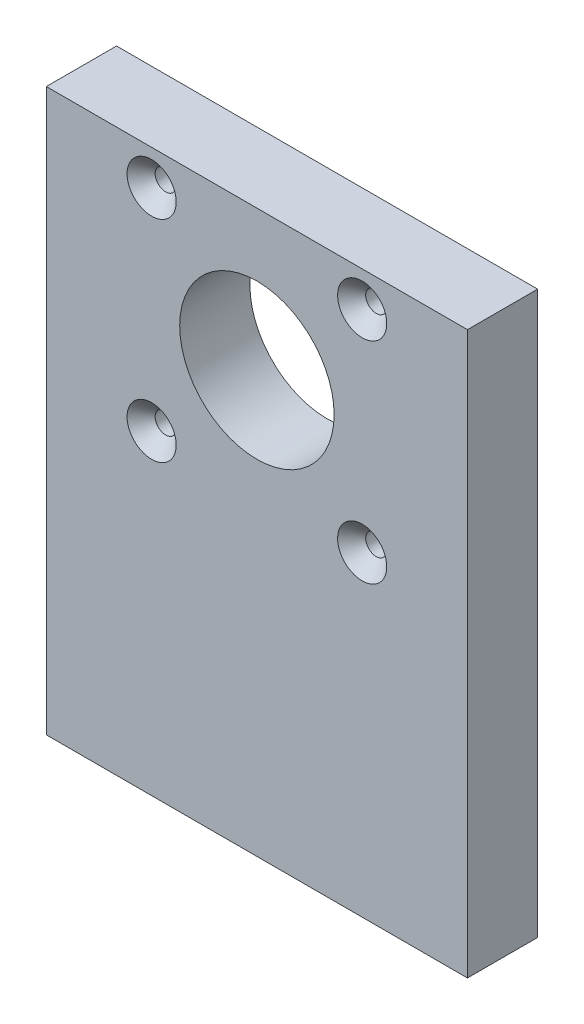
ISO-10303-21;
HEADER;
FILE_DESCRIPTION(('STEP AP214'),'2;1');
FILE_NAME('part.step','',(''),(''),'','','');
FILE_SCHEMA(('AUTOMOTIVE_DESIGN { 1 0 10303 214 1 1 1 1 }'));
ENDSEC;
DATA;
#1=APPLICATION_CONTEXT('core data for automotive mechanical design processes');
#2=APPLICATION_PROTOCOL_DEFINITION('international standard','automotive_design',2000,#1);
#3=PRODUCT_CONTEXT('',#1,'mechanical');
#4=PRODUCT('Part','Part','',(#3));
#5=PRODUCT_RELATED_PRODUCT_CATEGORY('part','',(#4));
#6=PRODUCT_DEFINITION_FORMATION('','',#4);
#7=PRODUCT_DEFINITION_CONTEXT('part definition',#1,'design');
#8=PRODUCT_DEFINITION('design','',#6,#7);
#9=PRODUCT_DEFINITION_SHAPE('','',#8);
#10=(LENGTH_UNIT() NAMED_UNIT(*) SI_UNIT(.MILLI.,.METRE.));
#11=(NAMED_UNIT(*) PLANE_ANGLE_UNIT() SI_UNIT($,.RADIAN.));
#12=(NAMED_UNIT(*) SI_UNIT($,.STERADIAN.) SOLID_ANGLE_UNIT());
#13=UNCERTAINTY_MEASURE_WITH_UNIT(LENGTH_MEASURE(1.E-05),#10,'distance_accuracy_value','');
#14=(GEOMETRIC_REPRESENTATION_CONTEXT(3) GLOBAL_UNCERTAINTY_ASSIGNED_CONTEXT((#13)) GLOBAL_UNIT_ASSIGNED_CONTEXT((#10,
#11,#12)) REPRESENTATION_CONTEXT('',''));
#15=CARTESIAN_POINT('',(0.,0.,0.));
#16=DIRECTION('',(0.,0.,1.));
#17=DIRECTION('',(1.,0.,0.));
#18=AXIS2_PLACEMENT_3D('',#15,#16,#17);
#19=CARTESIAN_POINT('',(0.,0.,10.));
#20=DIRECTION('',(0.,0.,-1.));
#21=DIRECTION('',(-1.,0.,0.));
#22=AXIS2_PLACEMENT_3D('',#19,#20,#21);
#23=PLANE('',#22);
#24=CARTESIAN_POINT('',(45.,45.,10.));
#25=DIRECTION('',(0.,0.,-1.));
#26=DIRECTION('',(-1.,0.,0.));
#27=AXIS2_PLACEMENT_3D('',#24,#25,#26);
#28=CIRCLE('',#27,3.5);
#29=CARTESIAN_POINT('',(41.5,45.,10.));
#30=VERTEX_POINT('',#29);
#31=EDGE_CURVE('E181',#30,#30,#28,.T.);
#32=ORIENTED_EDGE('',*,*,#31,.T.);
#33=EDGE_LOOP('',(#32));
#34=FACE_BOUND('',#33,.T.);
#35=CARTESIAN_POINT('',(15.,45.,10.));
#36=DIRECTION('',(0.,0.,-1.));
#37=DIRECTION('',(-1.,0.,0.));
#38=AXIS2_PLACEMENT_3D('',#35,#36,#37);
#39=CIRCLE('',#38,3.5);
#40=CARTESIAN_POINT('',(11.5,45.,10.));
#41=VERTEX_POINT('',#40);
#42=EDGE_CURVE('E178',#41,#41,#39,.T.);
#43=ORIENTED_EDGE('',*,*,#42,.T.);
#44=EDGE_LOOP('',(#43));
#45=FACE_BOUND('',#44,.T.);
#46=CARTESIAN_POINT('',(45.,75.,10.));
#47=DIRECTION('',(0.,0.,-1.));
#48=DIRECTION('',(-1.,0.,0.));
#49=AXIS2_PLACEMENT_3D('',#46,#47,#48);
#50=CIRCLE('',#49,3.5);
#51=CARTESIAN_POINT('',(41.5,75.,10.));
#52=VERTEX_POINT('',#51);
#53=EDGE_CURVE('E175',#52,#52,#50,.T.);
#54=ORIENTED_EDGE('',*,*,#53,.T.);
#55=EDGE_LOOP('',(#54));
#56=FACE_BOUND('',#55,.T.);
#57=CARTESIAN_POINT('',(15.,75.,10.));
#58=DIRECTION('',(0.,0.,-1.));
#59=DIRECTION('',(-1.,0.,0.));
#60=AXIS2_PLACEMENT_3D('',#57,#58,#59);
#61=CIRCLE('',#60,3.5);
#62=CARTESIAN_POINT('',(11.5,75.,10.));
#63=VERTEX_POINT('',#62);
#64=EDGE_CURVE('E172',#63,#63,#61,.T.);
#65=ORIENTED_EDGE('',*,*,#64,.T.);
#66=EDGE_LOOP('',(#65));
#67=FACE_BOUND('',#66,.T.);
#68=DIRECTION('',(0.,-1.,0.));
#69=VECTOR('',#68,1.);
#70=CARTESIAN_POINT('',(0.,0.,10.));
#71=LINE('',#70,#69);
#72=CARTESIAN_POINT('',(0.,80.,10.));
#73=VERTEX_POINT('',#72);
#74=CARTESIAN_POINT('',(0.,0.,10.));
#75=VERTEX_POINT('',#74);
#76=EDGE_CURVE('E149',#73,#75,#71,.T.);
#77=ORIENTED_EDGE('',*,*,#76,.T.);
#78=DIRECTION('',(1.,0.,0.));
#79=VECTOR('',#78,1.);
#80=CARTESIAN_POINT('',(0.,0.,10.));
#81=LINE('',#80,#79);
#82=CARTESIAN_POINT('',(60.,0.,10.));
#83=VERTEX_POINT('',#82);
#84=EDGE_CURVE('E93',#75,#83,#81,.T.);
#85=ORIENTED_EDGE('',*,*,#84,.T.);
#86=DIRECTION('',(0.,1.,0.));
#87=VECTOR('',#86,1.);
#88=CARTESIAN_POINT('',(60.,0.,10.));
#89=LINE('',#88,#87);
#90=CARTESIAN_POINT('',(60.,80.,10.));
#91=VERTEX_POINT('',#90);
#92=EDGE_CURVE('E152',#83,#91,#89,.T.);
#93=ORIENTED_EDGE('',*,*,#92,.T.);
#94=DIRECTION('',(-1.,0.,0.));
#95=VECTOR('',#94,1.);
#96=CARTESIAN_POINT('',(0.,80.,10.));
#97=LINE('',#96,#95);
#98=EDGE_CURVE('E61',#91,#73,#97,.T.);
#99=ORIENTED_EDGE('',*,*,#98,.T.);
#100=EDGE_LOOP('',(#77,#85,#93,#99));
#101=FACE_BOUND('',#100,.T.);
#102=CARTESIAN_POINT('',(30.,60.,10.));
#103=DIRECTION('',(0.,0.,1.));
#104=DIRECTION('',(1.,0.,0.));
#105=AXIS2_PLACEMENT_3D('',#102,#103,#104);
#106=CIRCLE('',#105,11.);
#107=CARTESIAN_POINT('',(41.,60.,10.));
#108=VERTEX_POINT('',#107);
#109=EDGE_CURVE('E143',#108,#108,#106,.T.);
#110=ORIENTED_EDGE('',*,*,#109,.F.);
#111=EDGE_LOOP('',(#110));
#112=FACE_BOUND('',#111,.T.);
#113=ADVANCED_FACE('F44',(#34,#45,#56,#67,#101,#112),#23,.F.);
#114=CARTESIAN_POINT('',(0.,0.,0.));
#115=DIRECTION('',(0.,0.,-1.));
#116=DIRECTION('',(-1.,0.,0.));
#117=AXIS2_PLACEMENT_3D('',#114,#115,#116);
#118=PLANE('',#117);
#119=CARTESIAN_POINT('',(45.,45.,0.));
#120=DIRECTION('',(0.,0.,1.));
#121=DIRECTION('',(1.,0.,0.));
#122=AXIS2_PLACEMENT_3D('',#119,#120,#121);
#123=CIRCLE('',#122,1.5);
#124=CARTESIAN_POINT('',(46.5,45.,0.));
#125=VERTEX_POINT('',#124);
#126=EDGE_CURVE('E133',#125,#125,#123,.T.);
#127=ORIENTED_EDGE('',*,*,#126,.T.);
#128=EDGE_LOOP('',(#127));
#129=FACE_BOUND('',#128,.T.);
#130=CARTESIAN_POINT('',(15.,75.,0.));
#131=DIRECTION('',(0.,0.,1.));
#132=DIRECTION('',(1.,0.,0.));
#133=AXIS2_PLACEMENT_3D('',#130,#131,#132);
#134=CIRCLE('',#133,1.5);
#135=CARTESIAN_POINT('',(16.5,75.,0.));
#136=VERTEX_POINT('',#135);
#137=EDGE_CURVE('E139',#136,#136,#134,.T.);
#138=ORIENTED_EDGE('',*,*,#137,.T.);
#139=EDGE_LOOP('',(#138));
#140=FACE_BOUND('',#139,.T.);
#141=DIRECTION('',(0.,-1.,0.));
#142=VECTOR('',#141,1.);
#143=CARTESIAN_POINT('',(0.,0.,0.));
#144=LINE('',#143,#142);
#145=CARTESIAN_POINT('',(0.,80.,0.));
#146=VERTEX_POINT('',#145);
#147=CARTESIAN_POINT('',(0.,0.,0.));
#148=VERTEX_POINT('',#147);
#149=EDGE_CURVE('E146',#146,#148,#144,.T.);
#150=ORIENTED_EDGE('',*,*,#149,.F.);
#151=DIRECTION('',(-1.,0.,0.));
#152=VECTOR('',#151,1.);
#153=CARTESIAN_POINT('',(0.,80.,0.));
#154=LINE('',#153,#152);
#155=CARTESIAN_POINT('',(60.,80.,0.));
#156=VERTEX_POINT('',#155);
#157=EDGE_CURVE('E85',#156,#146,#154,.T.);
#158=ORIENTED_EDGE('',*,*,#157,.F.);
#159=DIRECTION('',(0.,1.,0.));
#160=VECTOR('',#159,1.);
#161=CARTESIAN_POINT('',(60.,0.,0.));
#162=LINE('',#161,#160);
#163=CARTESIAN_POINT('',(60.,0.,0.));
#164=VERTEX_POINT('',#163);
#165=EDGE_CURVE('E79',#164,#156,#162,.T.);
#166=ORIENTED_EDGE('',*,*,#165,.F.);
#167=DIRECTION('',(1.,0.,0.));
#168=VECTOR('',#167,1.);
#169=CARTESIAN_POINT('',(0.,0.,0.));
#170=LINE('',#169,#168);
#171=EDGE_CURVE('E158',#148,#164,#170,.T.);
#172=ORIENTED_EDGE('',*,*,#171,.F.);
#173=EDGE_LOOP('',(#150,#158,#166,#172));
#174=FACE_BOUND('',#173,.T.);
#175=CARTESIAN_POINT('',(30.,60.,0.));
#176=DIRECTION('',(0.,0.,1.));
#177=DIRECTION('',(1.,0.,0.));
#178=AXIS2_PLACEMENT_3D('',#175,#176,#177);
#179=CIRCLE('',#178,11.);
#180=CARTESIAN_POINT('',(41.,60.,0.));
#181=VERTEX_POINT('',#180);
#182=EDGE_CURVE('E142',#181,#181,#179,.T.);
#183=ORIENTED_EDGE('',*,*,#182,.T.);
#184=EDGE_LOOP('',(#183));
#185=FACE_BOUND('',#184,.T.);
#186=CARTESIAN_POINT('',(45.,75.,0.));
#187=DIRECTION('',(0.,0.,1.));
#188=DIRECTION('',(1.,0.,0.));
#189=AXIS2_PLACEMENT_3D('',#186,#187,#188);
#190=CIRCLE('',#189,1.5);
#191=CARTESIAN_POINT('',(46.5,75.,0.));
#192=VERTEX_POINT('',#191);
#193=EDGE_CURVE('E136',#192,#192,#190,.T.);
#194=ORIENTED_EDGE('',*,*,#193,.T.);
#195=EDGE_LOOP('',(#194));
#196=FACE_BOUND('',#195,.T.);
#197=CARTESIAN_POINT('',(15.,45.,0.));
#198=DIRECTION('',(0.,0.,1.));
#199=DIRECTION('',(1.,0.,0.));
#200=AXIS2_PLACEMENT_3D('',#197,#198,#199);
#201=CIRCLE('',#200,1.5);
#202=CARTESIAN_POINT('',(16.5,45.,0.));
#203=VERTEX_POINT('',#202);
#204=EDGE_CURVE('E130',#203,#203,#201,.T.);
#205=ORIENTED_EDGE('',*,*,#204,.T.);
#206=EDGE_LOOP('',(#205));
#207=FACE_BOUND('',#206,.T.);
#208=ADVANCED_FACE('F206',(#129,#140,#174,#185,#196,#207),#118,.T.);
#209=CARTESIAN_POINT('',(0.,0.,10.));
#210=DIRECTION('',(1.,0.,0.));
#211=DIRECTION('',(0.,0.,-1.));
#212=AXIS2_PLACEMENT_3D('',#209,#210,#211);
#213=PLANE('',#212);
#214=ORIENTED_EDGE('',*,*,#149,.T.);
#215=DIRECTION('',(0.,0.,-1.));
#216=VECTOR('',#215,1.);
#217=CARTESIAN_POINT('',(0.,0.,10.));
#218=LINE('',#217,#216);
#219=EDGE_CURVE('E167',#75,#148,#218,.T.);
#220=ORIENTED_EDGE('',*,*,#219,.F.);
#221=ORIENTED_EDGE('',*,*,#76,.F.);
#222=DIRECTION('',(0.,0.,-1.));
#223=VECTOR('',#222,1.);
#224=CARTESIAN_POINT('',(0.,80.,10.));
#225=LINE('',#224,#223);
#226=EDGE_CURVE('E155',#73,#146,#225,.T.);
#227=ORIENTED_EDGE('',*,*,#226,.T.);
#228=EDGE_LOOP('',(#214,#220,#221,#227));
#229=FACE_BOUND('',#228,.T.);
#230=ADVANCED_FACE('F212',(#229),#213,.F.);
#231=CARTESIAN_POINT('',(0.,0.,10.));
#232=DIRECTION('',(0.,1.,0.));
#233=DIRECTION('',(0.,0.,1.));
#234=AXIS2_PLACEMENT_3D('',#231,#232,#233);
#235=PLANE('',#234);
#236=CARTESIAN_POINT('',(8.,0.,5.));
#237=DIRECTION('',(0.,-1.,0.));
#238=DIRECTION('',(0.,0.,-1.));
#239=AXIS2_PLACEMENT_3D('',#236,#237,#238);
#240=CIRCLE('',#239,1.64999999999999);
#241=CARTESIAN_POINT('',(8.,0.,3.35000000000001));
#242=VERTEX_POINT('',#241);
#243=EDGE_CURVE('E114',#242,#242,#240,.T.);
#244=ORIENTED_EDGE('',*,*,#243,.F.);
#245=EDGE_LOOP('',(#244));
#246=FACE_BOUND('',#245,.T.);
#247=CARTESIAN_POINT('',(30.,0.,5.));
#248=DIRECTION('',(0.,-1.,0.));
#249=DIRECTION('',(0.,0.,-1.));
#250=AXIS2_PLACEMENT_3D('',#247,#248,#249);
#251=CIRCLE('',#250,1.64999999999999);
#252=CARTESIAN_POINT('',(30.,0.,3.35000000000001));
#253=VERTEX_POINT('',#252);
#254=EDGE_CURVE('E113',#253,#253,#251,.T.);
#255=ORIENTED_EDGE('',*,*,#254,.F.);
#256=EDGE_LOOP('',(#255));
#257=FACE_BOUND('',#256,.T.);
#258=CARTESIAN_POINT('',(52.,0.,5.));
#259=DIRECTION('',(0.,-1.,0.));
#260=DIRECTION('',(0.,0.,-1.));
#261=AXIS2_PLACEMENT_3D('',#258,#259,#260);
#262=CIRCLE('',#261,1.64999999999999);
#263=CARTESIAN_POINT('',(52.,0.,3.35000000000001));
#264=VERTEX_POINT('',#263);
#265=EDGE_CURVE('E124',#264,#264,#262,.T.);
#266=ORIENTED_EDGE('',*,*,#265,.F.);
#267=EDGE_LOOP('',(#266));
#268=FACE_BOUND('',#267,.T.);
#269=ORIENTED_EDGE('',*,*,#171,.T.);
#270=DIRECTION('',(0.,0.,-1.));
#271=VECTOR('',#270,1.);
#272=CARTESIAN_POINT('',(60.,0.,10.));
#273=LINE('',#272,#271);
#274=EDGE_CURVE('E165',#83,#164,#273,.T.);
#275=ORIENTED_EDGE('',*,*,#274,.F.);
#276=ORIENTED_EDGE('',*,*,#84,.F.);
#277=ORIENTED_EDGE('',*,*,#219,.T.);
#278=EDGE_LOOP('',(#269,#275,#276,#277));
#279=FACE_BOUND('',#278,.T.);
#280=ADVANCED_FACE('F226',(#246,#257,#268,#279),#235,.F.);
#281=CARTESIAN_POINT('',(60.,0.,10.));
#282=DIRECTION('',(-1.,0.,0.));
#283=DIRECTION('',(0.,0.,1.));
#284=AXIS2_PLACEMENT_3D('',#281,#282,#283);
#285=PLANE('',#284);
#286=ORIENTED_EDGE('',*,*,#165,.T.);
#287=DIRECTION('',(0.,0.,-1.));
#288=VECTOR('',#287,1.);
#289=CARTESIAN_POINT('',(60.,80.,10.));
#290=LINE('',#289,#288);
#291=EDGE_CURVE('E163',#91,#156,#290,.T.);
#292=ORIENTED_EDGE('',*,*,#291,.F.);
#293=ORIENTED_EDGE('',*,*,#92,.F.);
#294=ORIENTED_EDGE('',*,*,#274,.T.);
#295=EDGE_LOOP('',(#286,#292,#293,#294));
#296=FACE_BOUND('',#295,.T.);
#297=ADVANCED_FACE('F223',(#296),#285,.F.);
#298=CARTESIAN_POINT('',(0.,80.,10.));
#299=DIRECTION('',(0.,-1.,0.));
#300=DIRECTION('',(0.,0.,-1.));
#301=AXIS2_PLACEMENT_3D('',#298,#299,#300);
#302=PLANE('',#301);
#303=ORIENTED_EDGE('',*,*,#157,.T.);
#304=ORIENTED_EDGE('',*,*,#226,.F.);
#305=ORIENTED_EDGE('',*,*,#98,.F.);
#306=ORIENTED_EDGE('',*,*,#291,.T.);
#307=EDGE_LOOP('',(#303,#304,#305,#306));
#308=FACE_BOUND('',#307,.T.);
#309=ADVANCED_FACE('F220',(#308),#302,.F.);
#310=CARTESIAN_POINT('',(30.,60.,10.));
#311=DIRECTION('',(0.,0.,-1.));
#312=DIRECTION('',(-1.,0.,0.));
#313=AXIS2_PLACEMENT_3D('',#310,#311,#312);
#314=CYLINDRICAL_SURFACE('',#313,11.);
#315=ORIENTED_EDGE('',*,*,#109,.T.);
#316=EDGE_LOOP('',(#315));
#317=FACE_BOUND('',#316,.T.);
#318=ORIENTED_EDGE('',*,*,#182,.F.);
#319=EDGE_LOOP('',(#318));
#320=FACE_BOUND('',#319,.T.);
#321=ADVANCED_FACE('F217',(#317,#320),#314,.F.);
#322=CARTESIAN_POINT('',(15.,75.,10.));
#323=DIRECTION('',(0.,0.,-1.));
#324=DIRECTION('',(-1.,0.,0.));
#325=AXIS2_PLACEMENT_3D('',#322,#323,#324);
#326=CYLINDRICAL_SURFACE('',#325,1.5);
#327=CARTESIAN_POINT('',(15.,75.,8.00000000000001));
#328=DIRECTION('',(0.,0.,-1.));
#329=DIRECTION('',(-1.,0.,0.));
#330=AXIS2_PLACEMENT_3D('',#327,#328,#329);
#331=CIRCLE('',#330,1.5);
#332=CARTESIAN_POINT('',(13.5,75.,8.00000000000001));
#333=VERTEX_POINT('',#332);
#334=EDGE_CURVE('E13',#333,#333,#331,.F.);
#335=ORIENTED_EDGE('',*,*,#334,.T.);
#336=EDGE_LOOP('',(#335));
#337=FACE_BOUND('',#336,.T.);
#338=ORIENTED_EDGE('',*,*,#137,.F.);
#339=EDGE_LOOP('',(#338));
#340=FACE_BOUND('',#339,.T.);
#341=ADVANCED_FACE('F273',(#337,#340),#326,.F.);
#342=CARTESIAN_POINT('',(45.,75.,10.));
#343=DIRECTION('',(0.,0.,-1.));
#344=DIRECTION('',(-1.,0.,0.));
#345=AXIS2_PLACEMENT_3D('',#342,#343,#344);
#346=CYLINDRICAL_SURFACE('',#345,1.5);
#347=CARTESIAN_POINT('',(45.,75.,8.00000000000001));
#348=DIRECTION('',(0.,0.,-1.));
#349=DIRECTION('',(-1.,0.,0.));
#350=AXIS2_PLACEMENT_3D('',#347,#348,#349);
#351=CIRCLE('',#350,1.5);
#352=CARTESIAN_POINT('',(43.5,75.,8.00000000000001));
#353=VERTEX_POINT('',#352);
#354=EDGE_CURVE('E53',#353,#353,#351,.F.);
#355=ORIENTED_EDGE('',*,*,#354,.T.);
#356=EDGE_LOOP('',(#355));
#357=FACE_BOUND('',#356,.T.);
#358=ORIENTED_EDGE('',*,*,#193,.F.);
#359=EDGE_LOOP('',(#358));
#360=FACE_BOUND('',#359,.T.);
#361=ADVANCED_FACE('F189',(#357,#360),#346,.F.);
#362=CARTESIAN_POINT('',(45.,45.,10.));
#363=DIRECTION('',(0.,0.,-1.));
#364=DIRECTION('',(-1.,0.,0.));
#365=AXIS2_PLACEMENT_3D('',#362,#363,#364);
#366=CYLINDRICAL_SURFACE('',#365,1.5);
#367=CARTESIAN_POINT('',(45.,45.,8.00000000000001));
#368=DIRECTION('',(0.,0.,-1.));
#369=DIRECTION('',(-1.,0.,0.));
#370=AXIS2_PLACEMENT_3D('',#367,#368,#369);
#371=CIRCLE('',#370,1.5);
#372=CARTESIAN_POINT('',(43.5,45.,8.00000000000001));
#373=VERTEX_POINT('',#372);
#374=EDGE_CURVE('E169',#373,#373,#371,.F.);
#375=ORIENTED_EDGE('',*,*,#374,.T.);
#376=EDGE_LOOP('',(#375));
#377=FACE_BOUND('',#376,.T.);
#378=ORIENTED_EDGE('',*,*,#126,.F.);
#379=EDGE_LOOP('',(#378));
#380=FACE_BOUND('',#379,.T.);
#381=ADVANCED_FACE('F243',(#377,#380),#366,.F.);
#382=CARTESIAN_POINT('',(15.,45.,10.));
#383=DIRECTION('',(0.,0.,-1.));
#384=DIRECTION('',(-1.,0.,0.));
#385=AXIS2_PLACEMENT_3D('',#382,#383,#384);
#386=CYLINDRICAL_SURFACE('',#385,1.5);
#387=CARTESIAN_POINT('',(15.,45.,8.00000000000001));
#388=DIRECTION('',(0.,0.,-1.));
#389=DIRECTION('',(-1.,0.,0.));
#390=AXIS2_PLACEMENT_3D('',#387,#388,#389);
#391=CIRCLE('',#390,1.5);
#392=CARTESIAN_POINT('',(13.5,45.,8.00000000000001));
#393=VERTEX_POINT('',#392);
#394=EDGE_CURVE('E184',#393,#393,#391,.F.);
#395=ORIENTED_EDGE('',*,*,#394,.T.);
#396=EDGE_LOOP('',(#395));
#397=FACE_BOUND('',#396,.T.);
#398=ORIENTED_EDGE('',*,*,#204,.F.);
#399=EDGE_LOOP('',(#398));
#400=FACE_BOUND('',#399,.T.);
#401=ADVANCED_FACE('F246',(#397,#400),#386,.F.);
#402=CARTESIAN_POINT('',(52.,10.1,5.));
#403=DIRECTION('',(0.,-1.,0.));
#404=DIRECTION('',(0.,0.,-1.));
#405=AXIS2_PLACEMENT_3D('',#402,#403,#404);
#406=CONICAL_SURFACE('',#405,1.65,1.02974425867665);
#407=CARTESIAN_POINT('',(52.,11.0914200213955,5.));
#408=VERTEX_POINT('',#407);
#409=VERTEX_LOOP('',#408);
#410=FACE_BOUND('',#409,.T.);
#411=CARTESIAN_POINT('',(52.,10.1,5.));
#412=DIRECTION('',(0.,-1.,0.));
#413=DIRECTION('',(0.,0.,-1.));
#414=AXIS2_PLACEMENT_3D('',#411,#412,#413);
#415=CIRCLE('',#414,1.65);
#416=CARTESIAN_POINT('',(52.,10.1,3.35));
#417=VERTEX_POINT('',#416);
#418=EDGE_CURVE('E127',#417,#417,#415,.T.);
#419=ORIENTED_EDGE('',*,*,#418,.T.);
#420=EDGE_LOOP('',(#419));
#421=FACE_BOUND('',#420,.T.);
#422=ADVANCED_FACE('F261',(#410,#421),#406,.F.);
#423=CARTESIAN_POINT('',(52.,0.,5.));
#424=DIRECTION('',(0.,-1.,0.));
#425=DIRECTION('',(0.,0.,-1.));
#426=AXIS2_PLACEMENT_3D('',#423,#424,#425);
#427=CYLINDRICAL_SURFACE('',#426,1.65);
#428=ORIENTED_EDGE('',*,*,#418,.F.);
#429=EDGE_LOOP('',(#428));
#430=FACE_BOUND('',#429,.T.);
#431=ORIENTED_EDGE('',*,*,#265,.T.);
#432=EDGE_LOOP('',(#431));
#433=FACE_BOUND('',#432,.T.);
#434=ADVANCED_FACE('F267',(#430,#433),#427,.F.);
#435=CARTESIAN_POINT('',(30.,10.1,5.));
#436=DIRECTION('',(0.,-1.,0.));
#437=DIRECTION('',(0.,0.,-1.));
#438=AXIS2_PLACEMENT_3D('',#435,#436,#437);
#439=CONICAL_SURFACE('',#438,1.65,1.02974425867665);
#440=CARTESIAN_POINT('',(30.,11.0914200213955,5.));
#441=VERTEX_POINT('',#440);
#442=VERTEX_LOOP('',#441);
#443=FACE_BOUND('',#442,.T.);
#444=CARTESIAN_POINT('',(30.,10.1,5.));
#445=DIRECTION('',(0.,-1.,0.));
#446=DIRECTION('',(0.,0.,-1.));
#447=AXIS2_PLACEMENT_3D('',#444,#445,#446);
#448=CIRCLE('',#447,1.65);
#449=CARTESIAN_POINT('',(30.,10.1,3.35));
#450=VERTEX_POINT('',#449);
#451=EDGE_CURVE('E117',#450,#450,#448,.T.);
#452=ORIENTED_EDGE('',*,*,#451,.T.);
#453=EDGE_LOOP('',(#452));
#454=FACE_BOUND('',#453,.T.);
#455=ADVANCED_FACE('F354',(#443,#454),#439,.F.);
#456=CARTESIAN_POINT('',(30.,0.,5.));
#457=DIRECTION('',(0.,-1.,0.));
#458=DIRECTION('',(0.,0.,-1.));
#459=AXIS2_PLACEMENT_3D('',#456,#457,#458);
#460=CYLINDRICAL_SURFACE('',#459,1.65);
#461=ORIENTED_EDGE('',*,*,#451,.F.);
#462=EDGE_LOOP('',(#461));
#463=FACE_BOUND('',#462,.T.);
#464=ORIENTED_EDGE('',*,*,#254,.T.);
#465=EDGE_LOOP('',(#464));
#466=FACE_BOUND('',#465,.T.);
#467=ADVANCED_FACE('F107',(#463,#466),#460,.F.);
#468=CARTESIAN_POINT('',(8.,10.1,5.));
#469=DIRECTION('',(0.,-1.,0.));
#470=DIRECTION('',(0.,0.,-1.));
#471=AXIS2_PLACEMENT_3D('',#468,#469,#470);
#472=CONICAL_SURFACE('',#471,1.65,1.02974425867665);
#473=CARTESIAN_POINT('',(8.,11.0914200213955,5.));
#474=VERTEX_POINT('',#473);
#475=VERTEX_LOOP('',#474);
#476=FACE_BOUND('',#475,.T.);
#477=CARTESIAN_POINT('',(8.,10.1,5.));
#478=DIRECTION('',(0.,-1.,0.));
#479=DIRECTION('',(0.,0.,-1.));
#480=AXIS2_PLACEMENT_3D('',#477,#478,#479);
#481=CIRCLE('',#480,1.65);
#482=CARTESIAN_POINT('',(8.,10.1,3.35));
#483=VERTEX_POINT('',#482);
#484=EDGE_CURVE('E111',#483,#483,#481,.T.);
#485=ORIENTED_EDGE('',*,*,#484,.T.);
#486=EDGE_LOOP('',(#485));
#487=FACE_BOUND('',#486,.T.);
#488=ADVANCED_FACE('F103',(#476,#487),#472,.F.);
#489=CARTESIAN_POINT('',(8.,0.,5.));
#490=DIRECTION('',(0.,-1.,0.));
#491=DIRECTION('',(0.,0.,-1.));
#492=AXIS2_PLACEMENT_3D('',#489,#490,#491);
#493=CYLINDRICAL_SURFACE('',#492,1.64999999999999);
#494=ORIENTED_EDGE('',*,*,#484,.F.);
#495=EDGE_LOOP('',(#494));
#496=FACE_BOUND('',#495,.T.);
#497=ORIENTED_EDGE('',*,*,#243,.T.);
#498=EDGE_LOOP('',(#497));
#499=FACE_BOUND('',#498,.T.);
#500=ADVANCED_FACE('F106',(#496,#499),#493,.F.);
#501=CARTESIAN_POINT('',(45.,45.,8.00000000000001));
#502=DIRECTION('',(0.,0.,1.));
#503=DIRECTION('',(1.,0.,0.));
#504=AXIS2_PLACEMENT_3D('',#501,#502,#503);
#505=CONICAL_SURFACE('',#504,1.5,0.785398163397451);
#506=ORIENTED_EDGE('',*,*,#31,.F.);
#507=EDGE_LOOP('',(#506));
#508=FACE_BOUND('',#507,.T.);
#509=ORIENTED_EDGE('',*,*,#374,.F.);
#510=EDGE_LOOP('',(#509));
#511=FACE_BOUND('',#510,.T.);
#512=ADVANCED_FACE('F201',(#508,#511),#505,.F.);
#513=CARTESIAN_POINT('',(15.,45.,8.00000000000001));
#514=DIRECTION('',(0.,0.,1.));
#515=DIRECTION('',(1.,0.,0.));
#516=AXIS2_PLACEMENT_3D('',#513,#514,#515);
#517=CONICAL_SURFACE('',#516,1.5,0.785398163397451);
#518=ORIENTED_EDGE('',*,*,#42,.F.);
#519=EDGE_LOOP('',(#518));
#520=FACE_BOUND('',#519,.T.);
#521=ORIENTED_EDGE('',*,*,#394,.F.);
#522=EDGE_LOOP('',(#521));
#523=FACE_BOUND('',#522,.T.);
#524=ADVANCED_FACE('F194',(#520,#523),#517,.F.);
#525=CARTESIAN_POINT('',(45.,75.,8.00000000000001));
#526=DIRECTION('',(0.,0.,1.));
#527=DIRECTION('',(1.,0.,0.));
#528=AXIS2_PLACEMENT_3D('',#525,#526,#527);
#529=CONICAL_SURFACE('',#528,1.5,0.785398163397451);
#530=ORIENTED_EDGE('',*,*,#53,.F.);
#531=EDGE_LOOP('',(#530));
#532=FACE_BOUND('',#531,.T.);
#533=ORIENTED_EDGE('',*,*,#354,.F.);
#534=EDGE_LOOP('',(#533));
#535=FACE_BOUND('',#534,.T.);
#536=ADVANCED_FACE('F192',(#532,#535),#529,.F.);
#537=CARTESIAN_POINT('',(15.,75.,8.00000000000001));
#538=DIRECTION('',(0.,0.,1.));
#539=DIRECTION('',(1.,0.,0.));
#540=AXIS2_PLACEMENT_3D('',#537,#538,#539);
#541=CONICAL_SURFACE('',#540,1.5,0.785398163397451);
#542=ORIENTED_EDGE('',*,*,#64,.F.);
#543=EDGE_LOOP('',(#542));
#544=FACE_BOUND('',#543,.T.);
#545=ORIENTED_EDGE('',*,*,#334,.F.);
#546=EDGE_LOOP('',(#545));
#547=FACE_BOUND('',#546,.T.);
#548=ADVANCED_FACE('F46',(#544,#547),#541,.F.);
#549=CLOSED_SHELL('',(#113,#208,#230,#280,#297,#309,#321,#341,#361,#381,#401,#422,#434,#455,
#467,#488,#500,#512,#524,#536,#548));
#550=MANIFOLD_SOLID_BREP('B2',#549);
#551=ADVANCED_BREP_SHAPE_REPRESENTATION('',(#18,#550),#14);
#552=SHAPE_DEFINITION_REPRESENTATION(#9,#551);
ENDSEC;
END-ISO-10303-21;
